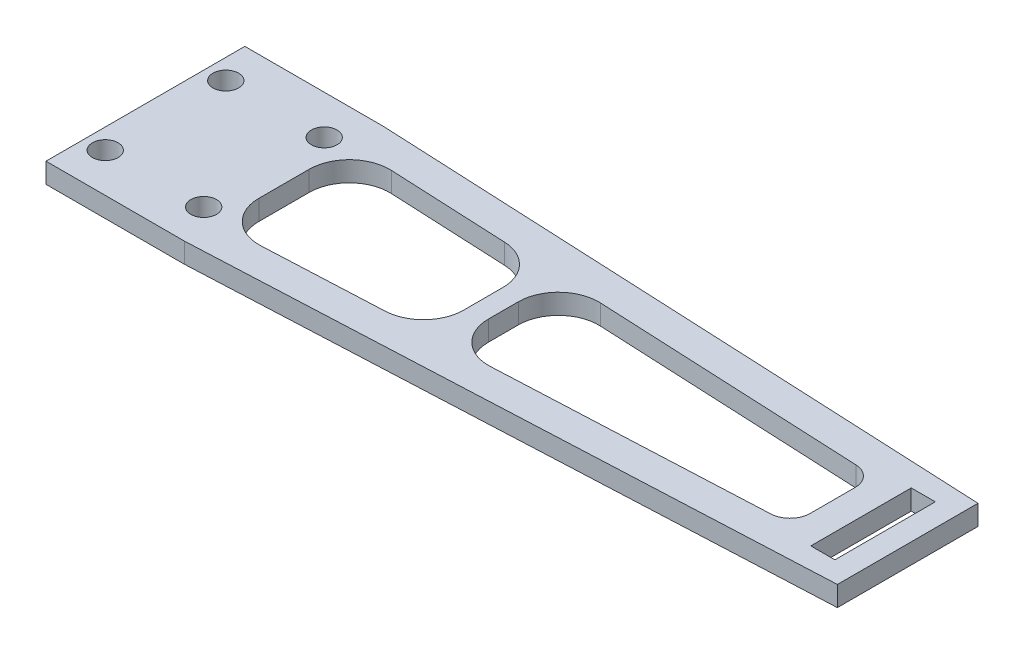
ISO-10303-21;
HEADER;
FILE_DESCRIPTION(('STEP AP214'),'2;1');
FILE_NAME('part.step','',(''),(''),'','','');
FILE_SCHEMA(('AUTOMOTIVE_DESIGN { 1 0 10303 214 1 1 1 1 }'));
ENDSEC;
DATA;
#1=APPLICATION_CONTEXT('core data for automotive mechanical design processes');
#2=APPLICATION_PROTOCOL_DEFINITION('international standard','automotive_design',2000,#1);
#3=PRODUCT_CONTEXT('',#1,'mechanical');
#4=PRODUCT('Part','Part','',(#3));
#5=PRODUCT_RELATED_PRODUCT_CATEGORY('part','',(#4));
#6=PRODUCT_DEFINITION_FORMATION('','',#4);
#7=PRODUCT_DEFINITION_CONTEXT('part definition',#1,'design');
#8=PRODUCT_DEFINITION('design','',#6,#7);
#9=PRODUCT_DEFINITION_SHAPE('','',#8);
#10=(LENGTH_UNIT() NAMED_UNIT(*) SI_UNIT(.MILLI.,.METRE.));
#11=(NAMED_UNIT(*) PLANE_ANGLE_UNIT() SI_UNIT($,.RADIAN.));
#12=(NAMED_UNIT(*) SI_UNIT($,.STERADIAN.) SOLID_ANGLE_UNIT());
#13=UNCERTAINTY_MEASURE_WITH_UNIT(LENGTH_MEASURE(1.E-05),#10,'distance_accuracy_value','');
#14=(GEOMETRIC_REPRESENTATION_CONTEXT(3) GLOBAL_UNCERTAINTY_ASSIGNED_CONTEXT((#13)) GLOBAL_UNIT_ASSIGNED_CONTEXT((#10,
#11,#12)) REPRESENTATION_CONTEXT('',''));
#15=CARTESIAN_POINT('',(0.,0.,0.));
#16=DIRECTION('',(0.,0.,1.));
#17=DIRECTION('',(1.,0.,0.));
#18=AXIS2_PLACEMENT_3D('',#15,#16,#17);
#19=CARTESIAN_POINT('',(0.,5.,0.));
#20=DIRECTION('',(1.,0.,0.));
#21=DIRECTION('',(0.,0.,-1.));
#22=AXIS2_PLACEMENT_3D('',#19,#20,#21);
#23=PLANE('',#22);
#24=DIRECTION('',(0.,0.,1.));
#25=VECTOR('',#24,1.);
#26=CARTESIAN_POINT('',(0.,0.,0.));
#27=LINE('',#26,#25);
#28=CARTESIAN_POINT('',(0.,0.,-49.5));
#29=VERTEX_POINT('',#28);
#30=CARTESIAN_POINT('',(0.,0.,0.));
#31=VERTEX_POINT('',#30);
#32=EDGE_CURVE('E464',#29,#31,#27,.T.);
#33=ORIENTED_EDGE('',*,*,#32,.T.);
#34=DIRECTION('',(0.,-1.,0.));
#35=VECTOR('',#34,1.);
#36=CARTESIAN_POINT('',(0.,5.,0.));
#37=LINE('',#36,#35);
#38=CARTESIAN_POINT('',(0.,5.,0.));
#39=VERTEX_POINT('',#38);
#40=EDGE_CURVE('E480',#39,#31,#37,.T.);
#41=ORIENTED_EDGE('',*,*,#40,.F.);
#42=DIRECTION('',(0.,0.,1.));
#43=VECTOR('',#42,1.);
#44=CARTESIAN_POINT('',(0.,5.,0.));
#45=LINE('',#44,#43);
#46=CARTESIAN_POINT('',(0.,5.,-49.5));
#47=VERTEX_POINT('',#46);
#48=EDGE_CURVE('E445',#47,#39,#45,.T.);
#49=ORIENTED_EDGE('',*,*,#48,.F.);
#50=DIRECTION('',(0.,-1.,0.));
#51=VECTOR('',#50,1.);
#52=CARTESIAN_POINT('',(0.,5.,-49.5));
#53=LINE('',#52,#51);
#54=EDGE_CURVE('E463',#47,#29,#53,.T.);
#55=ORIENTED_EDGE('',*,*,#54,.T.);
#56=EDGE_LOOP('',(#33,#41,#49,#55));
#57=FACE_BOUND('',#56,.T.);
#58=ADVANCED_FACE('F42',(#57),#23,.F.);
#59=CARTESIAN_POINT('',(0.,5.,0.));
#60=DIRECTION('',(0.,0.,-1.));
#61=DIRECTION('',(-1.,0.,0.));
#62=AXIS2_PLACEMENT_3D('',#59,#60,#61);
#63=PLANE('',#62);
#64=DIRECTION('',(1.,0.,0.));
#65=VECTOR('',#64,1.);
#66=CARTESIAN_POINT('',(0.,0.,0.));
#67=LINE('',#66,#65);
#68=CARTESIAN_POINT('',(34.5,0.,0.));
#69=VERTEX_POINT('',#68);
#70=EDGE_CURVE('E467',#31,#69,#67,.T.);
#71=ORIENTED_EDGE('',*,*,#70,.T.);
#72=DIRECTION('',(0.,-1.,0.));
#73=VECTOR('',#72,1.);
#74=CARTESIAN_POINT('',(34.5,5.,0.));
#75=LINE('',#74,#73);
#76=CARTESIAN_POINT('',(34.5,5.,0.));
#77=VERTEX_POINT('',#76);
#78=EDGE_CURVE('E478',#77,#69,#75,.T.);
#79=ORIENTED_EDGE('',*,*,#78,.F.);
#80=DIRECTION('',(1.,0.,0.));
#81=VECTOR('',#80,1.);
#82=CARTESIAN_POINT('',(0.,5.,0.));
#83=LINE('',#82,#81);
#84=EDGE_CURVE('E449',#39,#77,#83,.T.);
#85=ORIENTED_EDGE('',*,*,#84,.F.);
#86=ORIENTED_EDGE('',*,*,#40,.T.);
#87=EDGE_LOOP('',(#71,#79,#85,#86));
#88=FACE_BOUND('',#87,.T.);
#89=ADVANCED_FACE('F609',(#88),#63,.F.);
#90=CARTESIAN_POINT('',(34.5,5.,0.));
#91=DIRECTION('',(-1.,0.,0.));
#92=DIRECTION('',(0.,0.,1.));
#93=AXIS2_PLACEMENT_3D('',#90,#91,#92);
#94=PLANE('',#93);
#95=DIRECTION('',(0.,0.,-1.));
#96=VECTOR('',#95,1.);
#97=CARTESIAN_POINT('',(34.5,0.,0.));
#98=LINE('',#97,#96);
#99=CARTESIAN_POINT('',(34.5,0.,-18.486605101386));
#100=VERTEX_POINT('',#99);
#101=CARTESIAN_POINT('',(34.5,0.,-31.013394898614));
#102=VERTEX_POINT('',#101);
#103=EDGE_CURVE('E469',#100,#102,#98,.T.);
#104=ORIENTED_EDGE('',*,*,#103,.T.);
#105=DIRECTION('',(0.,1.,0.));
#106=VECTOR('',#105,1.);
#107=CARTESIAN_POINT('',(34.5,5.,-31.013394898614));
#108=LINE('',#107,#106);
#109=CARTESIAN_POINT('',(34.5,5.,-31.013394898614));
#110=VERTEX_POINT('',#109);
#111=EDGE_CURVE('E510',#102,#110,#108,.T.);
#112=ORIENTED_EDGE('',*,*,#111,.T.);
#113=DIRECTION('',(0.,0.,-1.));
#114=VECTOR('',#113,1.);
#115=CARTESIAN_POINT('',(34.5,5.,0.));
#116=LINE('',#115,#114);
#117=CARTESIAN_POINT('',(34.5,5.,-18.486605101386));
#118=VERTEX_POINT('',#117);
#119=EDGE_CURVE('E454',#118,#110,#116,.T.);
#120=ORIENTED_EDGE('',*,*,#119,.F.);
#121=DIRECTION('',(0.,1.,0.));
#122=VECTOR('',#121,1.);
#123=CARTESIAN_POINT('',(34.5,5.,-18.486605101386));
#124=LINE('',#123,#122);
#125=EDGE_CURVE('E508',#118,#100,#124,.F.);
#126=ORIENTED_EDGE('',*,*,#125,.T.);
#127=EDGE_LOOP('',(#104,#112,#120,#126));
#128=FACE_BOUND('',#127,.T.);
#129=ADVANCED_FACE('F588',(#128),#94,.F.);
#130=CARTESIAN_POINT('',(0.,5.,-49.5));
#131=DIRECTION('',(0.,0.,1.));
#132=DIRECTION('',(1.,0.,0.));
#133=AXIS2_PLACEMENT_3D('',#130,#131,#132);
#134=PLANE('',#133);
#135=DIRECTION('',(-1.,0.,0.));
#136=VECTOR('',#135,1.);
#137=CARTESIAN_POINT('',(0.,0.,-49.5));
#138=LINE('',#137,#136);
#139=CARTESIAN_POINT('',(34.5,0.,-49.5));
#140=VERTEX_POINT('',#139);
#141=EDGE_CURVE('E450',#140,#29,#138,.T.);
#142=ORIENTED_EDGE('',*,*,#141,.T.);
#143=ORIENTED_EDGE('',*,*,#54,.F.);
#144=DIRECTION('',(-1.,0.,0.));
#145=VECTOR('',#144,1.);
#146=CARTESIAN_POINT('',(0.,5.,-49.5));
#147=LINE('',#146,#145);
#148=CARTESIAN_POINT('',(34.5,5.,-49.5));
#149=VERTEX_POINT('',#148);
#150=EDGE_CURVE('E459',#149,#47,#147,.T.);
#151=ORIENTED_EDGE('',*,*,#150,.F.);
#152=DIRECTION('',(0.,-1.,0.));
#153=VECTOR('',#152,1.);
#154=CARTESIAN_POINT('',(34.5,5.,-49.5));
#155=LINE('',#154,#153);
#156=EDGE_CURVE('E475',#149,#140,#155,.T.);
#157=ORIENTED_EDGE('',*,*,#156,.T.);
#158=EDGE_LOOP('',(#142,#143,#151,#157));
#159=FACE_BOUND('',#158,.T.);
#160=ADVANCED_FACE('F695',(#159),#134,.F.);
#161=CARTESIAN_POINT('',(0.,5.,0.));
#162=DIRECTION('',(0.,-1.,0.));
#163=DIRECTION('',(0.,0.,-1.));
#164=AXIS2_PLACEMENT_3D('',#161,#162,#163);
#165=PLANE('',#164);
#166=DIRECTION('',(0.,0.,1.));
#167=VECTOR('',#166,1.);
#168=CARTESIAN_POINT('',(84.0949157909941,5.,-39.1752549484179));
#169=LINE('',#168,#167);
#170=CARTESIAN_POINT('',(84.0949157909941,5.,-29.6313456909831));
#171=VERTEX_POINT('',#170);
#172=CARTESIAN_POINT('',(84.0949157909941,5.,-19.868654309017));
#173=VERTEX_POINT('',#172);
#174=EDGE_CURVE('E324',#171,#173,#169,.T.);
#175=ORIENTED_EDGE('',*,*,#174,.T.);
#176=CARTESIAN_POINT('',(74.0949157909941,5.,-19.868654309017));
#177=DIRECTION('',(0.,-1.,0.));
#178=DIRECTION('',(0.,0.,-1.));
#179=AXIS2_PLACEMENT_3D('',#176,#177,#178);
#180=CIRCLE('',#179,10.);
#181=CARTESIAN_POINT('',(74.5613961492441,5.,-9.87954043063079));
#182=VERTEX_POINT('',#181);
#183=EDGE_CURVE('E304',#173,#182,#180,.T.);
#184=ORIENTED_EDGE('',*,*,#183,.T.);
#185=DIRECTION('',(-0.998911387838616,0.,0.0466480358249917));
#186=VECTOR('',#185,1.);
#187=CARTESIAN_POINT('',(84.0949157909941,5.,-10.3247450515821));
#188=LINE('',#187,#186);
#189=CARTESIAN_POINT('',(44.9664803582499,5.,-8.49749122299983));
#190=VERTEX_POINT('',#189);
#191=EDGE_CURVE('E318',#182,#190,#188,.T.);
#192=ORIENTED_EDGE('',*,*,#191,.T.);
#193=CARTESIAN_POINT('',(44.5,5.,-18.486605101386));
#194=DIRECTION('',(0.,-1.,0.));
#195=DIRECTION('',(0.,0.,-1.));
#196=AXIS2_PLACEMENT_3D('',#193,#194,#195);
#197=CIRCLE('',#196,10.);
#198=EDGE_CURVE('E373',#190,#118,#197,.T.);
#199=ORIENTED_EDGE('',*,*,#198,.T.);
#200=ORIENTED_EDGE('',*,*,#119,.T.);
#201=CARTESIAN_POINT('',(44.5,5.,-31.013394898614));
#202=DIRECTION('',(0.,-1.,0.));
#203=DIRECTION('',(0.,0.,-1.));
#204=AXIS2_PLACEMENT_3D('',#201,#202,#203);
#205=CIRCLE('',#204,10.);
#206=CARTESIAN_POINT('',(44.9664803582499,5.,-41.0025087770002));
#207=VERTEX_POINT('',#206);
#208=EDGE_CURVE('E368',#110,#207,#205,.T.);
#209=ORIENTED_EDGE('',*,*,#208,.T.);
#210=DIRECTION('',(0.998911387838616,0.,0.0466480358249918));
#211=VECTOR('',#210,1.);
#212=CARTESIAN_POINT('',(84.0949157909941,5.,-39.1752549484179));
#213=LINE('',#212,#211);
#214=CARTESIAN_POINT('',(74.561396149244,5.,-39.6204595693692));
#215=VERTEX_POINT('',#214);
#216=EDGE_CURVE('E352',#207,#215,#213,.T.);
#217=ORIENTED_EDGE('',*,*,#216,.T.);
#218=CARTESIAN_POINT('',(74.0949157909941,5.,-29.631345690983));
#219=DIRECTION('',(0.,-1.,0.));
#220=DIRECTION('',(0.,0.,-1.));
#221=AXIS2_PLACEMENT_3D('',#218,#219,#220);
#222=CIRCLE('',#221,10.);
#223=EDGE_CURVE('E363',#215,#171,#222,.T.);
#224=ORIENTED_EDGE('',*,*,#223,.T.);
#225=EDGE_LOOP('',(#175,#184,#192,#199,#200,#209,#217,#224));
#226=FACE_BOUND('',#225,.T.);
#227=CARTESIAN_POINT('',(29.5,5.,-39.75));
#228=DIRECTION('',(0.,1.,0.));
#229=DIRECTION('',(0.,0.,-1.));
#230=AXIS2_PLACEMENT_3D('',#227,#228,#229);
#231=CIRCLE('',#230,3.2);
#232=CARTESIAN_POINT('',(29.5,5.,-42.95));
#233=VERTEX_POINT('',#232);
#234=EDGE_CURVE('E557',#233,#233,#231,.T.);
#235=ORIENTED_EDGE('',*,*,#234,.F.);
#236=EDGE_LOOP('',(#235));
#237=FACE_BOUND('',#236,.T.);
#238=CARTESIAN_POINT('',(29.5,5.,-9.75));
#239=DIRECTION('',(0.,1.,0.));
#240=DIRECTION('',(0.,0.,1.));
#241=AXIS2_PLACEMENT_3D('',#238,#239,#240);
#242=CIRCLE('',#241,3.2);
#243=CARTESIAN_POINT('',(29.5,5.,-6.55));
#244=VERTEX_POINT('',#243);
#245=EDGE_CURVE('E553',#244,#244,#242,.T.);
#246=ORIENTED_EDGE('',*,*,#245,.F.);
#247=EDGE_LOOP('',(#246));
#248=FACE_BOUND('',#247,.T.);
#249=CARTESIAN_POINT('',(5.,5.,-9.75));
#250=DIRECTION('',(0.,1.,0.));
#251=DIRECTION('',(0.,0.,-1.));
#252=AXIS2_PLACEMENT_3D('',#249,#250,#251);
#253=CIRCLE('',#252,3.2);
#254=CARTESIAN_POINT('',(5.,5.,-12.95));
#255=VERTEX_POINT('',#254);
#256=EDGE_CURVE('E427',#255,#255,#253,.T.);
#257=ORIENTED_EDGE('',*,*,#256,.F.);
#258=EDGE_LOOP('',(#257));
#259=FACE_BOUND('',#258,.T.);
#260=CARTESIAN_POINT('',(5.,5.,-39.75));
#261=DIRECTION('',(0.,1.,0.));
#262=DIRECTION('',(0.,0.,1.));
#263=AXIS2_PLACEMENT_3D('',#260,#261,#262);
#264=CIRCLE('',#263,3.2);
#265=CARTESIAN_POINT('',(5.,5.,-36.55));
#266=VERTEX_POINT('',#265);
#267=EDGE_CURVE('E432',#266,#266,#264,.T.);
#268=ORIENTED_EDGE('',*,*,#267,.F.);
#269=EDGE_LOOP('',(#268));
#270=FACE_BOUND('',#269,.T.);
#271=ORIENTED_EDGE('',*,*,#48,.T.);
#272=ORIENTED_EDGE('',*,*,#84,.T.);
#273=DIRECTION('',(0.998911387838616,0.,-0.0466480358249917));
#274=VECTOR('',#273,1.);
#275=CARTESIAN_POINT('',(189.75,5.,-7.25));
#276=LINE('',#275,#274);
#277=CARTESIAN_POINT('',(189.75,5.,-7.25));
#278=VERTEX_POINT('',#277);
#279=EDGE_CURVE('E323',#77,#278,#276,.T.);
#280=ORIENTED_EDGE('',*,*,#279,.T.);
#281=DIRECTION('',(0.,0.,-1.));
#282=VECTOR('',#281,1.);
#283=CARTESIAN_POINT('',(189.75,5.,-42.25));
#284=LINE('',#283,#282);
#285=CARTESIAN_POINT('',(189.75,5.,-42.25));
#286=VERTEX_POINT('',#285);
#287=EDGE_CURVE('E279',#278,#286,#284,.T.);
#288=ORIENTED_EDGE('',*,*,#287,.T.);
#289=DIRECTION('',(-0.998911387838616,0.,-0.0466480358249917));
#290=VECTOR('',#289,1.);
#291=CARTESIAN_POINT('',(189.75,5.,-42.25));
#292=LINE('',#291,#290);
#293=EDGE_CURVE('E346',#286,#149,#292,.T.);
#294=ORIENTED_EDGE('',*,*,#293,.T.);
#295=ORIENTED_EDGE('',*,*,#150,.T.);
#296=EDGE_LOOP('',(#271,#272,#280,#288,#294,#295));
#297=FACE_BOUND('',#296,.T.);
#298=DIRECTION('',(1.,0.,0.));
#299=VECTOR('',#298,1.);
#300=CARTESIAN_POINT('',(178.13,5.,-12.25));
#301=LINE('',#300,#299);
#302=CARTESIAN_POINT('',(178.13,5.,-12.25));
#303=VERTEX_POINT('',#302);
#304=CARTESIAN_POINT('',(184.13,5.,-12.25));
#305=VERTEX_POINT('',#304);
#306=EDGE_CURVE('E250',#303,#305,#301,.T.);
#307=ORIENTED_EDGE('',*,*,#306,.F.);
#308=DIRECTION('',(0.,0.,1.));
#309=VECTOR('',#308,1.);
#310=CARTESIAN_POINT('',(178.13,5.,-37.25));
#311=LINE('',#310,#309);
#312=CARTESIAN_POINT('',(178.13,5.,-37.25));
#313=VERTEX_POINT('',#312);
#314=EDGE_CURVE('E221',#313,#303,#311,.T.);
#315=ORIENTED_EDGE('',*,*,#314,.F.);
#316=DIRECTION('',(-1.,0.,0.));
#317=VECTOR('',#316,1.);
#318=CARTESIAN_POINT('',(178.13,5.,-37.25));
#319=LINE('',#318,#317);
#320=CARTESIAN_POINT('',(184.13,5.,-37.25));
#321=VERTEX_POINT('',#320);
#322=EDGE_CURVE('E238',#321,#313,#319,.T.);
#323=ORIENTED_EDGE('',*,*,#322,.F.);
#324=DIRECTION('',(0.,0.,-1.));
#325=VECTOR('',#324,1.);
#326=CARTESIAN_POINT('',(184.13,5.,-37.25));
#327=LINE('',#326,#325);
#328=EDGE_CURVE('E242',#305,#321,#327,.T.);
#329=ORIENTED_EDGE('',*,*,#328,.F.);
#330=EDGE_LOOP('',(#307,#315,#323,#329));
#331=FACE_BOUND('',#330,.T.);
#332=DIRECTION('',(0.998911387838616,0.,-0.0466480358249917));
#333=VECTOR('',#332,1.);
#334=CARTESIAN_POINT('',(171.053500921479,5.,-14.3856129562263));
#335=LINE('',#334,#333);
#336=CARTESIAN_POINT('',(99.5613961492441,5.,-11.0470122502765));
#337=VERTEX_POINT('',#336);
#338=CARTESIAN_POINT('',(166.286741100604,5.,-14.1630106457507));
#339=VERTEX_POINT('',#338);
#340=EDGE_CURVE('E284',#337,#339,#335,.T.);
#341=ORIENTED_EDGE('',*,*,#340,.F.);
#342=CARTESIAN_POINT('',(99.0949157909941,5.,-21.0361261286627));
#343=DIRECTION('',(0.,-1.,0.));
#344=DIRECTION('',(0.,0.,-1.));
#345=AXIS2_PLACEMENT_3D('',#342,#343,#344);
#346=CIRCLE('',#345,10.);
#347=CARTESIAN_POINT('',(89.0949157909941,5.,-21.0361261286627));
#348=VERTEX_POINT('',#347);
#349=EDGE_CURVE('E512',#337,#348,#346,.T.);
#350=ORIENTED_EDGE('',*,*,#349,.T.);
#351=DIRECTION('',(0.,0.,1.));
#352=VECTOR('',#351,1.);
#353=CARTESIAN_POINT('',(89.0949157909941,5.,-38.9417605844888));
#354=LINE('',#353,#352);
#355=CARTESIAN_POINT('',(89.0949157909941,5.,-28.4638738713373));
#356=VERTEX_POINT('',#355);
#357=EDGE_CURVE('E264',#356,#348,#354,.T.);
#358=ORIENTED_EDGE('',*,*,#357,.F.);
#359=CARTESIAN_POINT('',(99.0949157909941,5.,-28.4638738713373));
#360=DIRECTION('',(0.,-1.,0.));
#361=DIRECTION('',(0.,0.,-1.));
#362=AXIS2_PLACEMENT_3D('',#359,#360,#361);
#363=CIRCLE('',#362,10.);
#364=CARTESIAN_POINT('',(99.5613961492441,5.,-38.4529877497235));
#365=VERTEX_POINT('',#364);
#366=EDGE_CURVE('E295',#356,#365,#363,.T.);
#367=ORIENTED_EDGE('',*,*,#366,.T.);
#368=DIRECTION('',(-0.998911387838616,0.,-0.0466480358249917));
#369=VECTOR('',#368,1.);
#370=CARTESIAN_POINT('',(171.053500921479,5.,-35.1143870437737));
#371=LINE('',#370,#369);
#372=CARTESIAN_POINT('',(166.286741100604,5.,-35.3369893542493));
#373=VERTEX_POINT('',#372);
#374=EDGE_CURVE('E272',#373,#365,#371,.T.);
#375=ORIENTED_EDGE('',*,*,#374,.F.);
#376=CARTESIAN_POINT('',(166.053500921479,5.,-30.3424324150563));
#377=DIRECTION('',(0.,-1.,0.));
#378=DIRECTION('',(0.,0.,-1.));
#379=AXIS2_PLACEMENT_3D('',#376,#377,#378);
#380=CIRCLE('',#379,5.);
#381=CARTESIAN_POINT('',(171.053500921479,5.,-30.3424324150563));
#382=VERTEX_POINT('',#381);
#383=EDGE_CURVE('E50',#373,#382,#380,.T.);
#384=ORIENTED_EDGE('',*,*,#383,.T.);
#385=DIRECTION('',(0.,0.,-1.));
#386=VECTOR('',#385,1.);
#387=CARTESIAN_POINT('',(171.053500921479,5.,-35.1143870437737));
#388=LINE('',#387,#386);
#389=CARTESIAN_POINT('',(171.053500921479,5.,-19.1575675849437));
#390=VERTEX_POINT('',#389);
#391=EDGE_CURVE('E394',#390,#382,#388,.T.);
#392=ORIENTED_EDGE('',*,*,#391,.F.);
#393=CARTESIAN_POINT('',(166.053500921479,5.,-19.1575675849437));
#394=DIRECTION('',(0.,-1.,0.));
#395=DIRECTION('',(0.,0.,-1.));
#396=AXIS2_PLACEMENT_3D('',#393,#394,#395);
#397=CIRCLE('',#396,5.);
#398=EDGE_CURVE('E387',#390,#339,#397,.T.);
#399=ORIENTED_EDGE('',*,*,#398,.T.);
#400=EDGE_LOOP('',(#341,#350,#358,#367,#375,#384,#392,#399));
#401=FACE_BOUND('',#400,.T.);
#402=ADVANCED_FACE('F534',(#226,#237,#248,#259,#270,#297,#331,#401),#165,.F.);
#403=CARTESIAN_POINT('',(0.,0.,0.));
#404=DIRECTION('',(0.,-1.,0.));
#405=DIRECTION('',(0.,0.,-1.));
#406=AXIS2_PLACEMENT_3D('',#403,#404,#405);
#407=PLANE('',#406);
#408=ORIENTED_EDGE('',*,*,#103,.F.);
#409=CARTESIAN_POINT('',(44.5,0.,-18.486605101386));
#410=DIRECTION('',(0.,-1.,0.));
#411=DIRECTION('',(0.,0.,-1.));
#412=AXIS2_PLACEMENT_3D('',#409,#410,#411);
#413=CIRCLE('',#412,10.);
#414=CARTESIAN_POINT('',(44.9664803582499,0.,-8.49749122299983));
#415=VERTEX_POINT('',#414);
#416=EDGE_CURVE('E377',#100,#415,#413,.F.);
#417=ORIENTED_EDGE('',*,*,#416,.T.);
#418=DIRECTION('',(-0.998911387838616,0.,0.0466480358249917));
#419=VECTOR('',#418,1.);
#420=CARTESIAN_POINT('',(84.0949157909941,0.,-10.3247450515821));
#421=LINE('',#420,#419);
#422=CARTESIAN_POINT('',(74.5613961492441,0.,-9.87954043063079));
#423=VERTEX_POINT('',#422);
#424=EDGE_CURVE('E411',#423,#415,#421,.T.);
#425=ORIENTED_EDGE('',*,*,#424,.F.);
#426=CARTESIAN_POINT('',(74.0949157909941,0.,-19.868654309017));
#427=DIRECTION('',(0.,-1.,0.));
#428=DIRECTION('',(0.,0.,-1.));
#429=AXIS2_PLACEMENT_3D('',#426,#427,#428);
#430=CIRCLE('',#429,10.);
#431=CARTESIAN_POINT('',(84.0949157909941,0.,-19.868654309017));
#432=VERTEX_POINT('',#431);
#433=EDGE_CURVE('E308',#423,#432,#430,.F.);
#434=ORIENTED_EDGE('',*,*,#433,.T.);
#435=DIRECTION('',(0.,0.,1.));
#436=VECTOR('',#435,1.);
#437=CARTESIAN_POINT('',(84.0949157909941,0.,-39.1752549484179));
#438=LINE('',#437,#436);
#439=CARTESIAN_POINT('',(84.0949157909941,0.,-29.6313456909831));
#440=VERTEX_POINT('',#439);
#441=EDGE_CURVE('E409',#440,#432,#438,.T.);
#442=ORIENTED_EDGE('',*,*,#441,.F.);
#443=CARTESIAN_POINT('',(74.0949157909941,0.,-29.631345690983));
#444=DIRECTION('',(0.,-1.,0.));
#445=DIRECTION('',(0.,0.,-1.));
#446=AXIS2_PLACEMENT_3D('',#443,#444,#445);
#447=CIRCLE('',#446,10.);
#448=CARTESIAN_POINT('',(74.561396149244,0.,-39.6204595693692));
#449=VERTEX_POINT('',#448);
#450=EDGE_CURVE('E367',#440,#449,#447,.F.);
#451=ORIENTED_EDGE('',*,*,#450,.T.);
#452=DIRECTION('',(0.998911387838616,0.,0.0466480358249918));
#453=VECTOR('',#452,1.);
#454=CARTESIAN_POINT('',(84.0949157909941,0.,-39.1752549484179));
#455=LINE('',#454,#453);
#456=CARTESIAN_POINT('',(44.9664803582499,0.,-41.0025087770002));
#457=VERTEX_POINT('',#456);
#458=EDGE_CURVE('E406',#457,#449,#455,.T.);
#459=ORIENTED_EDGE('',*,*,#458,.F.);
#460=CARTESIAN_POINT('',(44.5,0.,-31.013394898614));
#461=DIRECTION('',(0.,-1.,0.));
#462=DIRECTION('',(0.,0.,-1.));
#463=AXIS2_PLACEMENT_3D('',#460,#461,#462);
#464=CIRCLE('',#463,10.);
#465=EDGE_CURVE('E372',#457,#102,#464,.F.);
#466=ORIENTED_EDGE('',*,*,#465,.T.);
#467=EDGE_LOOP('',(#408,#417,#425,#434,#442,#451,#459,#466));
#468=FACE_BOUND('',#467,.T.);
#469=CARTESIAN_POINT('',(29.5,0.,-39.75));
#470=DIRECTION('',(0.,1.,0.));
#471=DIRECTION('',(0.,0.,-1.));
#472=AXIS2_PLACEMENT_3D('',#469,#470,#471);
#473=CIRCLE('',#472,3.2);
#474=CARTESIAN_POINT('',(29.5,0.,-42.95));
#475=VERTEX_POINT('',#474);
#476=EDGE_CURVE('E425',#475,#475,#473,.T.);
#477=ORIENTED_EDGE('',*,*,#476,.T.);
#478=EDGE_LOOP('',(#477));
#479=FACE_BOUND('',#478,.T.);
#480=CARTESIAN_POINT('',(29.5,0.,-9.75));
#481=DIRECTION('',(0.,1.,0.));
#482=DIRECTION('',(0.,0.,1.));
#483=AXIS2_PLACEMENT_3D('',#480,#481,#482);
#484=CIRCLE('',#483,3.2);
#485=CARTESIAN_POINT('',(29.5,0.,-6.55));
#486=VERTEX_POINT('',#485);
#487=EDGE_CURVE('E556',#486,#486,#484,.T.);
#488=ORIENTED_EDGE('',*,*,#487,.T.);
#489=EDGE_LOOP('',(#488));
#490=FACE_BOUND('',#489,.T.);
#491=CARTESIAN_POINT('',(5.,0.,-9.75));
#492=DIRECTION('',(0.,1.,0.));
#493=DIRECTION('',(0.,0.,-1.));
#494=AXIS2_PLACEMENT_3D('',#491,#492,#493);
#495=CIRCLE('',#494,3.2);
#496=CARTESIAN_POINT('',(5.,0.,-12.95));
#497=VERTEX_POINT('',#496);
#498=EDGE_CURVE('E433',#497,#497,#495,.T.);
#499=ORIENTED_EDGE('',*,*,#498,.T.);
#500=EDGE_LOOP('',(#499));
#501=FACE_BOUND('',#500,.T.);
#502=CARTESIAN_POINT('',(5.,0.,-39.75));
#503=DIRECTION('',(0.,1.,0.));
#504=DIRECTION('',(0.,0.,1.));
#505=AXIS2_PLACEMENT_3D('',#502,#503,#504);
#506=CIRCLE('',#505,3.2);
#507=CARTESIAN_POINT('',(5.,0.,-36.55));
#508=VERTEX_POINT('',#507);
#509=EDGE_CURVE('E443',#508,#508,#506,.T.);
#510=ORIENTED_EDGE('',*,*,#509,.T.);
#511=EDGE_LOOP('',(#510));
#512=FACE_BOUND('',#511,.T.);
#513=ORIENTED_EDGE('',*,*,#32,.F.);
#514=ORIENTED_EDGE('',*,*,#141,.F.);
#515=DIRECTION('',(-0.998911387838616,0.,-0.0466480358249917));
#516=VECTOR('',#515,1.);
#517=CARTESIAN_POINT('',(189.75,0.,-42.25));
#518=LINE('',#517,#516);
#519=CARTESIAN_POINT('',(189.75,0.,-42.25));
#520=VERTEX_POINT('',#519);
#521=EDGE_CURVE('E403',#520,#140,#518,.T.);
#522=ORIENTED_EDGE('',*,*,#521,.F.);
#523=DIRECTION('',(0.,0.,-1.));
#524=VECTOR('',#523,1.);
#525=CARTESIAN_POINT('',(189.75,0.,-42.25));
#526=LINE('',#525,#524);
#527=CARTESIAN_POINT('',(189.75,0.,-7.25));
#528=VERTEX_POINT('',#527);
#529=EDGE_CURVE('E331',#528,#520,#526,.T.);
#530=ORIENTED_EDGE('',*,*,#529,.F.);
#531=DIRECTION('',(0.998911387838616,0.,-0.0466480358249917));
#532=VECTOR('',#531,1.);
#533=CARTESIAN_POINT('',(189.75,0.,-7.25));
#534=LINE('',#533,#532);
#535=EDGE_CURVE('E347',#69,#528,#534,.T.);
#536=ORIENTED_EDGE('',*,*,#535,.F.);
#537=ORIENTED_EDGE('',*,*,#70,.F.);
#538=EDGE_LOOP('',(#513,#514,#522,#530,#536,#537));
#539=FACE_BOUND('',#538,.T.);
#540=DIRECTION('',(0.,0.,1.));
#541=VECTOR('',#540,1.);
#542=CARTESIAN_POINT('',(178.13,0.,-37.25));
#543=LINE('',#542,#541);
#544=CARTESIAN_POINT('',(178.13,0.,-37.25));
#545=VERTEX_POINT('',#544);
#546=CARTESIAN_POINT('',(178.13,0.,-12.25));
#547=VERTEX_POINT('',#546);
#548=EDGE_CURVE('E218',#545,#547,#543,.T.);
#549=ORIENTED_EDGE('',*,*,#548,.T.);
#550=DIRECTION('',(1.,0.,0.));
#551=VECTOR('',#550,1.);
#552=CARTESIAN_POINT('',(178.13,0.,-12.25));
#553=LINE('',#552,#551);
#554=CARTESIAN_POINT('',(184.13,0.,-12.25));
#555=VERTEX_POINT('',#554);
#556=EDGE_CURVE('E230',#547,#555,#553,.T.);
#557=ORIENTED_EDGE('',*,*,#556,.T.);
#558=DIRECTION('',(0.,0.,-1.));
#559=VECTOR('',#558,1.);
#560=CARTESIAN_POINT('',(184.13,0.,-37.25));
#561=LINE('',#560,#559);
#562=CARTESIAN_POINT('',(184.13,0.,-37.25));
#563=VERTEX_POINT('',#562);
#564=EDGE_CURVE('E234',#555,#563,#561,.T.);
#565=ORIENTED_EDGE('',*,*,#564,.T.);
#566=DIRECTION('',(-1.,0.,0.));
#567=VECTOR('',#566,1.);
#568=CARTESIAN_POINT('',(178.13,0.,-37.25));
#569=LINE('',#568,#567);
#570=EDGE_CURVE('E226',#563,#545,#569,.T.);
#571=ORIENTED_EDGE('',*,*,#570,.T.);
#572=EDGE_LOOP('',(#549,#557,#565,#571));
#573=FACE_BOUND('',#572,.T.);
#574=DIRECTION('',(0.,0.,-1.));
#575=VECTOR('',#574,1.);
#576=CARTESIAN_POINT('',(171.053500921479,0.,-35.1143870437737));
#577=LINE('',#576,#575);
#578=CARTESIAN_POINT('',(171.053500921479,0.,-19.1575675849437));
#579=VERTEX_POINT('',#578);
#580=CARTESIAN_POINT('',(171.053500921479,0.,-30.3424324150563));
#581=VERTEX_POINT('',#580);
#582=EDGE_CURVE('E275',#579,#581,#577,.T.);
#583=ORIENTED_EDGE('',*,*,#582,.T.);
#584=CARTESIAN_POINT('',(166.053500921479,0.,-30.3424324150563));
#585=DIRECTION('',(0.,-1.,0.));
#586=DIRECTION('',(0.,0.,-1.));
#587=AXIS2_PLACEMENT_3D('',#584,#585,#586);
#588=CIRCLE('',#587,5.);
#589=CARTESIAN_POINT('',(166.286741100604,0.,-35.3369893542493));
#590=VERTEX_POINT('',#589);
#591=EDGE_CURVE('E12',#581,#590,#588,.F.);
#592=ORIENTED_EDGE('',*,*,#591,.T.);
#593=DIRECTION('',(-0.998911387838616,0.,-0.0466480358249917));
#594=VECTOR('',#593,1.);
#595=CARTESIAN_POINT('',(171.053500921479,0.,-35.1143870437737));
#596=LINE('',#595,#594);
#597=CARTESIAN_POINT('',(99.5613961492441,0.,-38.4529877497235));
#598=VERTEX_POINT('',#597);
#599=EDGE_CURVE('E277',#590,#598,#596,.T.);
#600=ORIENTED_EDGE('',*,*,#599,.T.);
#601=CARTESIAN_POINT('',(99.0949157909941,0.,-28.4638738713373));
#602=DIRECTION('',(0.,-1.,0.));
#603=DIRECTION('',(0.,0.,-1.));
#604=AXIS2_PLACEMENT_3D('',#601,#602,#603);
#605=CIRCLE('',#604,10.);
#606=CARTESIAN_POINT('',(89.0949157909941,0.,-28.4638738713373));
#607=VERTEX_POINT('',#606);
#608=EDGE_CURVE('E301',#598,#607,#605,.F.);
#609=ORIENTED_EDGE('',*,*,#608,.T.);
#610=DIRECTION('',(0.,0.,1.));
#611=VECTOR('',#610,1.);
#612=CARTESIAN_POINT('',(89.0949157909941,0.,-38.9417605844888));
#613=LINE('',#612,#611);
#614=CARTESIAN_POINT('',(89.0949157909941,0.,-21.0361261286627));
#615=VERTEX_POINT('',#614);
#616=EDGE_CURVE('E268',#607,#615,#613,.T.);
#617=ORIENTED_EDGE('',*,*,#616,.T.);
#618=CARTESIAN_POINT('',(99.0949157909941,0.,-21.0361261286627));
#619=DIRECTION('',(0.,-1.,0.));
#620=DIRECTION('',(0.,0.,-1.));
#621=AXIS2_PLACEMENT_3D('',#618,#619,#620);
#622=CIRCLE('',#621,10.);
#623=CARTESIAN_POINT('',(99.5613961492441,0.,-11.0470122502765));
#624=VERTEX_POINT('',#623);
#625=EDGE_CURVE('E302',#615,#624,#622,.F.);
#626=ORIENTED_EDGE('',*,*,#625,.T.);
#627=DIRECTION('',(0.998911387838616,0.,-0.0466480358249917));
#628=VECTOR('',#627,1.);
#629=CARTESIAN_POINT('',(171.053500921479,0.,-14.3856129562263));
#630=LINE('',#629,#628);
#631=CARTESIAN_POINT('',(166.286741100604,0.,-14.1630106457507));
#632=VERTEX_POINT('',#631);
#633=EDGE_CURVE('E271',#624,#632,#630,.T.);
#634=ORIENTED_EDGE('',*,*,#633,.T.);
#635=CARTESIAN_POINT('',(166.053500921479,0.,-19.1575675849437));
#636=DIRECTION('',(0.,-1.,0.));
#637=DIRECTION('',(0.,0.,-1.));
#638=AXIS2_PLACEMENT_3D('',#635,#636,#637);
#639=CIRCLE('',#638,5.);
#640=EDGE_CURVE('E391',#632,#579,#639,.F.);
#641=ORIENTED_EDGE('',*,*,#640,.T.);
#642=EDGE_LOOP('',(#583,#592,#600,#609,#617,#626,#634,#641));
#643=FACE_BOUND('',#642,.T.);
#644=ADVANCED_FACE('F236',(#468,#479,#490,#501,#512,#539,#573,#643),#407,.T.);
#645=CARTESIAN_POINT('',(5.,0.,-39.75));
#646=DIRECTION('',(0.,1.,0.));
#647=DIRECTION('',(0.,0.,1.));
#648=AXIS2_PLACEMENT_3D('',#645,#646,#647);
#649=CYLINDRICAL_SURFACE('',#648,3.2);
#650=ORIENTED_EDGE('',*,*,#509,.F.);
#651=EDGE_LOOP('',(#650));
#652=FACE_BOUND('',#651,.T.);
#653=ORIENTED_EDGE('',*,*,#267,.T.);
#654=EDGE_LOOP('',(#653));
#655=FACE_BOUND('',#654,.T.);
#656=ADVANCED_FACE('F683',(#652,#655),#649,.F.);
#657=CARTESIAN_POINT('',(5.,0.,-9.75));
#658=DIRECTION('',(0.,1.,0.));
#659=DIRECTION('',(0.,0.,1.));
#660=AXIS2_PLACEMENT_3D('',#657,#658,#659);
#661=CYLINDRICAL_SURFACE('',#660,3.2);
#662=ORIENTED_EDGE('',*,*,#498,.F.);
#663=EDGE_LOOP('',(#662));
#664=FACE_BOUND('',#663,.T.);
#665=ORIENTED_EDGE('',*,*,#256,.T.);
#666=EDGE_LOOP('',(#665));
#667=FACE_BOUND('',#666,.T.);
#668=ADVANCED_FACE('F876',(#664,#667),#661,.F.);
#669=CARTESIAN_POINT('',(29.5,0.,-9.75));
#670=DIRECTION('',(0.,1.,0.));
#671=DIRECTION('',(0.,0.,1.));
#672=AXIS2_PLACEMENT_3D('',#669,#670,#671);
#673=CYLINDRICAL_SURFACE('',#672,3.2);
#674=ORIENTED_EDGE('',*,*,#487,.F.);
#675=EDGE_LOOP('',(#674));
#676=FACE_BOUND('',#675,.T.);
#677=ORIENTED_EDGE('',*,*,#245,.T.);
#678=EDGE_LOOP('',(#677));
#679=FACE_BOUND('',#678,.T.);
#680=ADVANCED_FACE('F865',(#676,#679),#673,.F.);
#681=CARTESIAN_POINT('',(29.5,0.,-39.75));
#682=DIRECTION('',(0.,1.,0.));
#683=DIRECTION('',(0.,0.,1.));
#684=AXIS2_PLACEMENT_3D('',#681,#682,#683);
#685=CYLINDRICAL_SURFACE('',#684,3.2);
#686=ORIENTED_EDGE('',*,*,#476,.F.);
#687=EDGE_LOOP('',(#686));
#688=FACE_BOUND('',#687,.T.);
#689=ORIENTED_EDGE('',*,*,#234,.T.);
#690=EDGE_LOOP('',(#689));
#691=FACE_BOUND('',#690,.T.);
#692=ADVANCED_FACE('F841',(#688,#691),#685,.F.);
#693=CARTESIAN_POINT('',(189.75,0.,-42.25));
#694=DIRECTION('',(1.,0.,0.));
#695=DIRECTION('',(0.,0.,-1.));
#696=AXIS2_PLACEMENT_3D('',#693,#694,#695);
#697=PLANE('',#696);
#698=ORIENTED_EDGE('',*,*,#287,.F.);
#699=DIRECTION('',(0.,1.,0.));
#700=VECTOR('',#699,1.);
#701=CARTESIAN_POINT('',(189.75,0.,-7.25));
#702=LINE('',#701,#700);
#703=EDGE_CURVE('E332',#528,#278,#702,.T.);
#704=ORIENTED_EDGE('',*,*,#703,.F.);
#705=ORIENTED_EDGE('',*,*,#529,.T.);
#706=DIRECTION('',(0.,1.,0.));
#707=VECTOR('',#706,1.);
#708=CARTESIAN_POINT('',(189.75,0.,-42.25));
#709=LINE('',#708,#707);
#710=EDGE_CURVE('E418',#520,#286,#709,.T.);
#711=ORIENTED_EDGE('',*,*,#710,.T.);
#712=EDGE_LOOP('',(#698,#704,#705,#711));
#713=FACE_BOUND('',#712,.T.);
#714=ADVANCED_FACE('F606',(#713),#697,.T.);
#715=CARTESIAN_POINT('',(189.75,0.,-7.25));
#716=DIRECTION('',(0.0466480358249917,0.,0.998911387838616));
#717=DIRECTION('',(0.998911387838616,0.,-0.0466480358249917));
#718=AXIS2_PLACEMENT_3D('',#715,#716,#717);
#719=PLANE('',#718);
#720=ORIENTED_EDGE('',*,*,#279,.F.);
#721=ORIENTED_EDGE('',*,*,#78,.T.);
#722=ORIENTED_EDGE('',*,*,#535,.T.);
#723=ORIENTED_EDGE('',*,*,#703,.T.);
#724=EDGE_LOOP('',(#720,#721,#722,#723));
#725=FACE_BOUND('',#724,.T.);
#726=ADVANCED_FACE('F599',(#725),#719,.T.);
#727=CARTESIAN_POINT('',(84.0949157909941,0.,-10.3247450515821));
#728=DIRECTION('',(-0.0466480358249917,0.,-0.998911387838616));
#729=DIRECTION('',(-0.998911387838616,0.,0.0466480358249917));
#730=AXIS2_PLACEMENT_3D('',#727,#728,#729);
#731=PLANE('',#730);
#732=ORIENTED_EDGE('',*,*,#191,.F.);
#733=DIRECTION('',(0.,1.,0.));
#734=VECTOR('',#733,1.);
#735=CARTESIAN_POINT('',(74.5613961492441,0.,-9.87954043063079));
#736=LINE('',#735,#734);
#737=EDGE_CURVE('E501',#182,#423,#736,.F.);
#738=ORIENTED_EDGE('',*,*,#737,.T.);
#739=ORIENTED_EDGE('',*,*,#424,.T.);
#740=DIRECTION('',(0.,1.,0.));
#741=VECTOR('',#740,1.);
#742=CARTESIAN_POINT('',(44.9664803582499,0.,-8.49749122299983));
#743=LINE('',#742,#741);
#744=EDGE_CURVE('E499',#415,#190,#743,.T.);
#745=ORIENTED_EDGE('',*,*,#744,.T.);
#746=EDGE_LOOP('',(#732,#738,#739,#745));
#747=FACE_BOUND('',#746,.T.);
#748=ADVANCED_FACE('F597',(#747),#731,.T.);
#749=CARTESIAN_POINT('',(84.0949157909941,0.,-39.1752549484179));
#750=DIRECTION('',(-1.,0.,0.));
#751=DIRECTION('',(0.,0.,1.));
#752=AXIS2_PLACEMENT_3D('',#749,#750,#751);
#753=PLANE('',#752);
#754=ORIENTED_EDGE('',*,*,#441,.T.);
#755=DIRECTION('',(0.,1.,0.));
#756=VECTOR('',#755,1.);
#757=CARTESIAN_POINT('',(84.0949157909941,5.,-19.868654309017));
#758=LINE('',#757,#756);
#759=EDGE_CURVE('E496',#432,#173,#758,.T.);
#760=ORIENTED_EDGE('',*,*,#759,.T.);
#761=ORIENTED_EDGE('',*,*,#174,.F.);
#762=DIRECTION('',(0.,1.,0.));
#763=VECTOR('',#762,1.);
#764=CARTESIAN_POINT('',(84.0949157909941,0.,-29.6313456909831));
#765=LINE('',#764,#763);
#766=EDGE_CURVE('E494',#171,#440,#765,.F.);
#767=ORIENTED_EDGE('',*,*,#766,.T.);
#768=EDGE_LOOP('',(#754,#760,#761,#767));
#769=FACE_BOUND('',#768,.T.);
#770=ADVANCED_FACE('F567',(#769),#753,.T.);
#771=CARTESIAN_POINT('',(84.0949157909941,0.,-39.1752549484179));
#772=DIRECTION('',(-0.0466480358249918,0.,0.998911387838616));
#773=DIRECTION('',(0.998911387838616,0.,0.0466480358249918));
#774=AXIS2_PLACEMENT_3D('',#771,#772,#773);
#775=PLANE('',#774);
#776=ORIENTED_EDGE('',*,*,#458,.T.);
#777=DIRECTION('',(0.,1.,0.));
#778=VECTOR('',#777,1.);
#779=CARTESIAN_POINT('',(74.561396149244,5.,-39.6204595693692));
#780=LINE('',#779,#778);
#781=EDGE_CURVE('E505',#449,#215,#780,.T.);
#782=ORIENTED_EDGE('',*,*,#781,.T.);
#783=ORIENTED_EDGE('',*,*,#216,.F.);
#784=DIRECTION('',(0.,1.,0.));
#785=VECTOR('',#784,1.);
#786=CARTESIAN_POINT('',(44.9664803582499,0.,-41.0025087770002));
#787=LINE('',#786,#785);
#788=EDGE_CURVE('E503',#207,#457,#787,.F.);
#789=ORIENTED_EDGE('',*,*,#788,.T.);
#790=EDGE_LOOP('',(#776,#782,#783,#789));
#791=FACE_BOUND('',#790,.T.);
#792=ADVANCED_FACE('F580',(#791),#775,.T.);
#793=CARTESIAN_POINT('',(189.75,0.,-42.25));
#794=DIRECTION('',(0.0466480358249917,0.,-0.998911387838616));
#795=DIRECTION('',(-0.998911387838616,0.,-0.0466480358249917));
#796=AXIS2_PLACEMENT_3D('',#793,#794,#795);
#797=PLANE('',#796);
#798=ORIENTED_EDGE('',*,*,#293,.F.);
#799=ORIENTED_EDGE('',*,*,#710,.F.);
#800=ORIENTED_EDGE('',*,*,#521,.T.);
#801=ORIENTED_EDGE('',*,*,#156,.F.);
#802=EDGE_LOOP('',(#798,#799,#800,#801));
#803=FACE_BOUND('',#802,.T.);
#804=ADVANCED_FACE('F748',(#803),#797,.T.);
#805=CARTESIAN_POINT('',(89.0949157909941,0.,-38.9417605844888));
#806=DIRECTION('',(-1.,0.,0.));
#807=DIRECTION('',(0.,0.,1.));
#808=AXIS2_PLACEMENT_3D('',#805,#806,#807);
#809=PLANE('',#808);
#810=ORIENTED_EDGE('',*,*,#357,.T.);
#811=DIRECTION('',(0.,1.,0.));
#812=VECTOR('',#811,1.);
#813=CARTESIAN_POINT('',(89.0949157909941,0.,-21.0361261286627));
#814=LINE('',#813,#812);
#815=EDGE_CURVE('E489',#348,#615,#814,.F.);
#816=ORIENTED_EDGE('',*,*,#815,.T.);
#817=ORIENTED_EDGE('',*,*,#616,.F.);
#818=DIRECTION('',(0.,1.,0.));
#819=VECTOR('',#818,1.);
#820=CARTESIAN_POINT('',(89.0949157909941,5.,-28.4638738713373));
#821=LINE('',#820,#819);
#822=EDGE_CURVE('E486',#607,#356,#821,.T.);
#823=ORIENTED_EDGE('',*,*,#822,.T.);
#824=EDGE_LOOP('',(#810,#816,#817,#823));
#825=FACE_BOUND('',#824,.T.);
#826=ADVANCED_FACE('F532',(#825),#809,.F.);
#827=CARTESIAN_POINT('',(171.053500921479,0.,-35.1143870437737));
#828=DIRECTION('',(0.0466480358249917,0.,-0.998911387838616));
#829=DIRECTION('',(-0.998911387838616,0.,-0.0466480358249917));
#830=AXIS2_PLACEMENT_3D('',#827,#828,#829);
#831=PLANE('',#830);
#832=ORIENTED_EDGE('',*,*,#599,.F.);
#833=DIRECTION('',(0.,1.,0.));
#834=VECTOR('',#833,1.);
#835=CARTESIAN_POINT('',(166.286741100604,5.,-35.3369893542493));
#836=LINE('',#835,#834);
#837=EDGE_CURVE('E386',#590,#373,#836,.T.);
#838=ORIENTED_EDGE('',*,*,#837,.T.);
#839=ORIENTED_EDGE('',*,*,#374,.T.);
#840=DIRECTION('',(0.,1.,0.));
#841=VECTOR('',#840,1.);
#842=CARTESIAN_POINT('',(99.561396149244,0.,-38.4529877497235));
#843=LINE('',#842,#841);
#844=EDGE_CURVE('E491',#365,#598,#843,.F.);
#845=ORIENTED_EDGE('',*,*,#844,.T.);
#846=EDGE_LOOP('',(#832,#838,#839,#845));
#847=FACE_BOUND('',#846,.T.);
#848=ADVANCED_FACE('F541',(#847),#831,.F.);
#849=CARTESIAN_POINT('',(171.053500921479,0.,-35.1143870437737));
#850=DIRECTION('',(1.,0.,0.));
#851=DIRECTION('',(0.,0.,-1.));
#852=AXIS2_PLACEMENT_3D('',#849,#850,#851);
#853=PLANE('',#852);
#854=ORIENTED_EDGE('',*,*,#582,.F.);
#855=DIRECTION('',(0.,1.,0.));
#856=VECTOR('',#855,1.);
#857=CARTESIAN_POINT('',(171.053500921479,5.,-19.1575675849437));
#858=LINE('',#857,#856);
#859=EDGE_CURVE('E381',#579,#390,#858,.T.);
#860=ORIENTED_EDGE('',*,*,#859,.T.);
#861=ORIENTED_EDGE('',*,*,#391,.T.);
#862=DIRECTION('',(0.,1.,0.));
#863=VECTOR('',#862,1.);
#864=CARTESIAN_POINT('',(171.053500921479,0.,-30.3424324150563));
#865=LINE('',#864,#863);
#866=EDGE_CURVE('E379',#382,#581,#865,.F.);
#867=ORIENTED_EDGE('',*,*,#866,.T.);
#868=EDGE_LOOP('',(#854,#860,#861,#867));
#869=FACE_BOUND('',#868,.T.);
#870=ADVANCED_FACE('F544',(#869),#853,.F.);
#871=CARTESIAN_POINT('',(171.053500921479,0.,-14.3856129562263));
#872=DIRECTION('',(0.0466480358249917,0.,0.998911387838616));
#873=DIRECTION('',(0.998911387838616,0.,-0.0466480358249917));
#874=AXIS2_PLACEMENT_3D('',#871,#872,#873);
#875=PLANE('',#874);
#876=ORIENTED_EDGE('',*,*,#340,.T.);
#877=DIRECTION('',(0.,1.,0.));
#878=VECTOR('',#877,1.);
#879=CARTESIAN_POINT('',(166.286741100604,0.,-14.1630106457507));
#880=LINE('',#879,#878);
#881=EDGE_CURVE('E384',#339,#632,#880,.F.);
#882=ORIENTED_EDGE('',*,*,#881,.T.);
#883=ORIENTED_EDGE('',*,*,#633,.F.);
#884=DIRECTION('',(0.,1.,0.));
#885=VECTOR('',#884,1.);
#886=CARTESIAN_POINT('',(99.561396149244,5.,-11.0470122502765));
#887=LINE('',#886,#885);
#888=EDGE_CURVE('E483',#624,#337,#887,.T.);
#889=ORIENTED_EDGE('',*,*,#888,.T.);
#890=EDGE_LOOP('',(#876,#882,#883,#889));
#891=FACE_BOUND('',#890,.T.);
#892=ADVANCED_FACE('F528',(#891),#875,.F.);
#893=CARTESIAN_POINT('',(178.13,0.,-37.25));
#894=DIRECTION('',(-1.,0.,0.));
#895=DIRECTION('',(0.,0.,1.));
#896=AXIS2_PLACEMENT_3D('',#893,#894,#895);
#897=PLANE('',#896);
#898=ORIENTED_EDGE('',*,*,#314,.T.);
#899=DIRECTION('',(0.,1.,0.));
#900=VECTOR('',#899,1.);
#901=CARTESIAN_POINT('',(178.13,0.,-12.25));
#902=LINE('',#901,#900);
#903=EDGE_CURVE('E214',#547,#303,#902,.T.);
#904=ORIENTED_EDGE('',*,*,#903,.F.);
#905=ORIENTED_EDGE('',*,*,#548,.F.);
#906=DIRECTION('',(0.,1.,0.));
#907=VECTOR('',#906,1.);
#908=CARTESIAN_POINT('',(178.13,0.,-37.25));
#909=LINE('',#908,#907);
#910=EDGE_CURVE('E262',#545,#313,#909,.T.);
#911=ORIENTED_EDGE('',*,*,#910,.T.);
#912=EDGE_LOOP('',(#898,#904,#905,#911));
#913=FACE_BOUND('',#912,.T.);
#914=ADVANCED_FACE('F216',(#913),#897,.F.);
#915=CARTESIAN_POINT('',(178.13,0.,-37.25));
#916=DIRECTION('',(0.,0.,-1.));
#917=DIRECTION('',(-1.,0.,0.));
#918=AXIS2_PLACEMENT_3D('',#915,#916,#917);
#919=PLANE('',#918);
#920=ORIENTED_EDGE('',*,*,#322,.T.);
#921=ORIENTED_EDGE('',*,*,#910,.F.);
#922=ORIENTED_EDGE('',*,*,#570,.F.);
#923=DIRECTION('',(0.,1.,0.));
#924=VECTOR('',#923,1.);
#925=CARTESIAN_POINT('',(184.13,0.,-37.25));
#926=LINE('',#925,#924);
#927=EDGE_CURVE('E265',#563,#321,#926,.T.);
#928=ORIENTED_EDGE('',*,*,#927,.T.);
#929=EDGE_LOOP('',(#920,#921,#922,#928));
#930=FACE_BOUND('',#929,.T.);
#931=ADVANCED_FACE('F800',(#930),#919,.F.);
#932=CARTESIAN_POINT('',(184.13,0.,-37.25));
#933=DIRECTION('',(1.,0.,0.));
#934=DIRECTION('',(0.,0.,-1.));
#935=AXIS2_PLACEMENT_3D('',#932,#933,#934);
#936=PLANE('',#935);
#937=ORIENTED_EDGE('',*,*,#328,.T.);
#938=ORIENTED_EDGE('',*,*,#927,.F.);
#939=ORIENTED_EDGE('',*,*,#564,.F.);
#940=DIRECTION('',(0.,1.,0.));
#941=VECTOR('',#940,1.);
#942=CARTESIAN_POINT('',(184.13,0.,-12.25));
#943=LINE('',#942,#941);
#944=EDGE_CURVE('E225',#555,#305,#943,.T.);
#945=ORIENTED_EDGE('',*,*,#944,.T.);
#946=EDGE_LOOP('',(#937,#938,#939,#945));
#947=FACE_BOUND('',#946,.T.);
#948=ADVANCED_FACE('F790',(#947),#936,.F.);
#949=CARTESIAN_POINT('',(178.13,0.,-12.25));
#950=DIRECTION('',(0.,0.,1.));
#951=DIRECTION('',(1.,0.,0.));
#952=AXIS2_PLACEMENT_3D('',#949,#950,#951);
#953=PLANE('',#952);
#954=ORIENTED_EDGE('',*,*,#306,.T.);
#955=ORIENTED_EDGE('',*,*,#944,.F.);
#956=ORIENTED_EDGE('',*,*,#556,.F.);
#957=ORIENTED_EDGE('',*,*,#903,.T.);
#958=EDGE_LOOP('',(#954,#955,#956,#957));
#959=FACE_BOUND('',#958,.T.);
#960=ADVANCED_FACE('F231',(#959),#953,.F.);
#961=CARTESIAN_POINT('',(99.0949157909941,0.,-21.0361261286627));
#962=DIRECTION('',(0.,-1.,0.));
#963=DIRECTION('',(0.,0.,-1.));
#964=AXIS2_PLACEMENT_3D('',#961,#962,#963);
#965=CYLINDRICAL_SURFACE('',#964,10.);
#966=ORIENTED_EDGE('',*,*,#625,.F.);
#967=ORIENTED_EDGE('',*,*,#815,.F.);
#968=ORIENTED_EDGE('',*,*,#349,.F.);
#969=ORIENTED_EDGE('',*,*,#888,.F.);
#970=EDGE_LOOP('',(#966,#967,#968,#969));
#971=FACE_BOUND('',#970,.T.);
#972=ADVANCED_FACE('F530',(#971),#965,.F.);
#973=CARTESIAN_POINT('',(99.0949157909941,0.,-28.4638738713373));
#974=DIRECTION('',(0.,-1.,0.));
#975=DIRECTION('',(0.,0.,-1.));
#976=AXIS2_PLACEMENT_3D('',#973,#974,#975);
#977=CYLINDRICAL_SURFACE('',#976,10.);
#978=ORIENTED_EDGE('',*,*,#608,.F.);
#979=ORIENTED_EDGE('',*,*,#844,.F.);
#980=ORIENTED_EDGE('',*,*,#366,.F.);
#981=ORIENTED_EDGE('',*,*,#822,.F.);
#982=EDGE_LOOP('',(#978,#979,#980,#981));
#983=FACE_BOUND('',#982,.T.);
#984=ADVANCED_FACE('F539',(#983),#977,.F.);
#985=CARTESIAN_POINT('',(74.0949157909941,0.,-19.868654309017));
#986=DIRECTION('',(0.,-1.,0.));
#987=DIRECTION('',(0.,0.,-1.));
#988=AXIS2_PLACEMENT_3D('',#985,#986,#987);
#989=CYLINDRICAL_SURFACE('',#988,10.);
#990=ORIENTED_EDGE('',*,*,#433,.F.);
#991=ORIENTED_EDGE('',*,*,#737,.F.);
#992=ORIENTED_EDGE('',*,*,#183,.F.);
#993=ORIENTED_EDGE('',*,*,#759,.F.);
#994=EDGE_LOOP('',(#990,#991,#992,#993));
#995=FACE_BOUND('',#994,.T.);
#996=ADVANCED_FACE('F596',(#995),#989,.F.);
#997=CARTESIAN_POINT('',(74.0949157909941,0.,-29.631345690983));
#998=DIRECTION('',(0.,-1.,0.));
#999=DIRECTION('',(0.,0.,-1.));
#1000=AXIS2_PLACEMENT_3D('',#997,#998,#999);
#1001=CYLINDRICAL_SURFACE('',#1000,10.);
#1002=ORIENTED_EDGE('',*,*,#450,.F.);
#1003=ORIENTED_EDGE('',*,*,#766,.F.);
#1004=ORIENTED_EDGE('',*,*,#223,.F.);
#1005=ORIENTED_EDGE('',*,*,#781,.F.);
#1006=EDGE_LOOP('',(#1002,#1003,#1004,#1005));
#1007=FACE_BOUND('',#1006,.T.);
#1008=ADVANCED_FACE('F572',(#1007),#1001,.F.);
#1009=CARTESIAN_POINT('',(44.5,5.,-31.013394898614));
#1010=DIRECTION('',(0.,1.,0.));
#1011=DIRECTION('',(0.,0.,1.));
#1012=AXIS2_PLACEMENT_3D('',#1009,#1010,#1011);
#1013=CYLINDRICAL_SURFACE('',#1012,10.);
#1014=ORIENTED_EDGE('',*,*,#465,.F.);
#1015=ORIENTED_EDGE('',*,*,#788,.F.);
#1016=ORIENTED_EDGE('',*,*,#208,.F.);
#1017=ORIENTED_EDGE('',*,*,#111,.F.);
#1018=EDGE_LOOP('',(#1014,#1015,#1016,#1017));
#1019=FACE_BOUND('',#1018,.T.);
#1020=ADVANCED_FACE('F584',(#1019),#1013,.F.);
#1021=CARTESIAN_POINT('',(44.5,0.,-18.486605101386));
#1022=DIRECTION('',(0.,1.,0.));
#1023=DIRECTION('',(0.,0.,1.));
#1024=AXIS2_PLACEMENT_3D('',#1021,#1022,#1023);
#1025=CYLINDRICAL_SURFACE('',#1024,10.);
#1026=ORIENTED_EDGE('',*,*,#416,.F.);
#1027=ORIENTED_EDGE('',*,*,#125,.F.);
#1028=ORIENTED_EDGE('',*,*,#198,.F.);
#1029=ORIENTED_EDGE('',*,*,#744,.F.);
#1030=EDGE_LOOP('',(#1026,#1027,#1028,#1029));
#1031=FACE_BOUND('',#1030,.T.);
#1032=ADVANCED_FACE('F592',(#1031),#1025,.F.);
#1033=CARTESIAN_POINT('',(166.053500921479,0.,-19.1575675849437));
#1034=DIRECTION('',(0.,-1.,0.));
#1035=DIRECTION('',(0.,0.,-1.));
#1036=AXIS2_PLACEMENT_3D('',#1033,#1034,#1035);
#1037=CYLINDRICAL_SURFACE('',#1036,5.);
#1038=ORIENTED_EDGE('',*,*,#640,.F.);
#1039=ORIENTED_EDGE('',*,*,#881,.F.);
#1040=ORIENTED_EDGE('',*,*,#398,.F.);
#1041=ORIENTED_EDGE('',*,*,#859,.F.);
#1042=EDGE_LOOP('',(#1038,#1039,#1040,#1041));
#1043=FACE_BOUND('',#1042,.T.);
#1044=ADVANCED_FACE('F548',(#1043),#1037,.F.);
#1045=CARTESIAN_POINT('',(166.053500921479,0.,-30.3424324150563));
#1046=DIRECTION('',(0.,-1.,0.));
#1047=DIRECTION('',(0.,0.,-1.));
#1048=AXIS2_PLACEMENT_3D('',#1045,#1046,#1047);
#1049=CYLINDRICAL_SURFACE('',#1048,5.);
#1050=ORIENTED_EDGE('',*,*,#591,.F.);
#1051=ORIENTED_EDGE('',*,*,#866,.F.);
#1052=ORIENTED_EDGE('',*,*,#383,.F.);
#1053=ORIENTED_EDGE('',*,*,#837,.F.);
#1054=EDGE_LOOP('',(#1050,#1051,#1052,#1053));
#1055=FACE_BOUND('',#1054,.T.);
#1056=ADVANCED_FACE('F44',(#1055),#1049,.F.);
#1057=CLOSED_SHELL('',(#58,#89,#129,#160,#402,#644,#656,#668,#680,#692,#714,#726,#748,#770,#792,
#804,#826,#848,#870,#892,#914,#931,#948,#960,#972,#984,#996,#1008,#1020,#1032,#1044,#1056));
#1058=MANIFOLD_SOLID_BREP('B2',#1057);
#1059=ADVANCED_BREP_SHAPE_REPRESENTATION('',(#18,#1058),#14);
#1060=SHAPE_DEFINITION_REPRESENTATION(#9,#1059);
ENDSEC;
END-ISO-10303-21;
